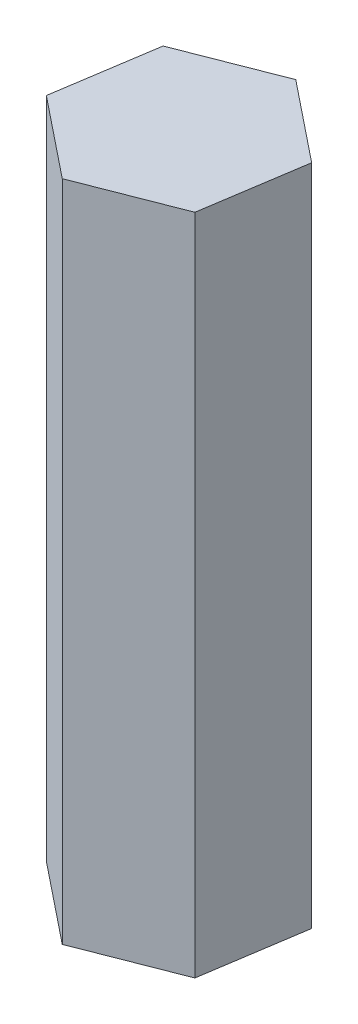
ISO-10303-21;
HEADER;
FILE_DESCRIPTION(('STEP AP214'),'2;1');
FILE_NAME('part.step','',(''),(''),'','','');
FILE_SCHEMA(('AUTOMOTIVE_DESIGN { 1 0 10303 214 1 1 1 1 }'));
ENDSEC;
DATA;
#1=APPLICATION_CONTEXT('core data for automotive mechanical design processes');
#2=APPLICATION_PROTOCOL_DEFINITION('international standard','automotive_design',2000,#1);
#3=PRODUCT_CONTEXT('',#1,'mechanical');
#4=PRODUCT('Part','Part','',(#3));
#5=PRODUCT_RELATED_PRODUCT_CATEGORY('part','',(#4));
#6=PRODUCT_DEFINITION_FORMATION('','',#4);
#7=PRODUCT_DEFINITION_CONTEXT('part definition',#1,'design');
#8=PRODUCT_DEFINITION('design','',#6,#7);
#9=PRODUCT_DEFINITION_SHAPE('','',#8);
#10=(LENGTH_UNIT() NAMED_UNIT(*) SI_UNIT(.MILLI.,.METRE.));
#11=(NAMED_UNIT(*) PLANE_ANGLE_UNIT() SI_UNIT($,.RADIAN.));
#12=(NAMED_UNIT(*) SI_UNIT($,.STERADIAN.) SOLID_ANGLE_UNIT());
#13=UNCERTAINTY_MEASURE_WITH_UNIT(LENGTH_MEASURE(1.E-05),#10,'distance_accuracy_value','');
#14=(GEOMETRIC_REPRESENTATION_CONTEXT(3) GLOBAL_UNCERTAINTY_ASSIGNED_CONTEXT((#13)) GLOBAL_UNIT_ASSIGNED_CONTEXT((#10,
#11,#12)) REPRESENTATION_CONTEXT('',''));
#15=CARTESIAN_POINT('',(0.,0.,0.));
#16=DIRECTION('',(0.,0.,1.));
#17=DIRECTION('',(1.,0.,0.));
#18=AXIS2_PLACEMENT_3D('',#15,#16,#17);
#19=CARTESIAN_POINT('',(14.3918598685271,100.,-5.61201788258893));
#20=DIRECTION('',(-0.625201883015332,0.,0.780463071178953));
#21=DIRECTION('',(0.780463071178953,0.,0.625201883015332));
#22=AXIS2_PLACEMENT_3D('',#19,#20,#21);
#23=PLANE('',#22);
#24=DIRECTION('',(-0.780463071178953,0.,-0.625201883015332));
#25=VECTOR('',#24,1.);
#26=CARTESIAN_POINT('',(14.3918598685271,0.,-5.61201788258893));
#27=LINE('',#26,#25);
#28=CARTESIAN_POINT('',(14.3918598685271,0.,-5.61201788258893));
#29=VERTEX_POINT('',#28);
#30=CARTESIAN_POINT('',(2.33577988144897,0.,-15.2697251951447));
#31=VERTEX_POINT('',#30);
#32=EDGE_CURVE('E134',#29,#31,#27,.T.);
#33=ORIENTED_EDGE('',*,*,#32,.T.);
#34=DIRECTION('',(0.,-1.,0.));
#35=VECTOR('',#34,1.);
#36=CARTESIAN_POINT('',(2.33577988144897,100.,-15.2697251951447));
#37=LINE('',#36,#35);
#38=CARTESIAN_POINT('',(2.33577988144897,100.,-15.2697251951447));
#39=VERTEX_POINT('',#38);
#40=EDGE_CURVE('E11',#39,#31,#37,.T.);
#41=ORIENTED_EDGE('',*,*,#40,.F.);
#42=DIRECTION('',(-0.780463071178953,0.,-0.625201883015332));
#43=VECTOR('',#42,1.);
#44=CARTESIAN_POINT('',(14.3918598685271,100.,-5.61201788258893));
#45=LINE('',#44,#43);
#46=CARTESIAN_POINT('',(14.3918598685271,100.,-5.61201788258893));
#47=VERTEX_POINT('',#46);
#48=EDGE_CURVE('E150',#47,#39,#45,.T.);
#49=ORIENTED_EDGE('',*,*,#48,.F.);
#50=DIRECTION('',(0.,-1.,0.));
#51=VECTOR('',#50,1.);
#52=CARTESIAN_POINT('',(14.3918598685271,100.,-5.61201788258893));
#53=LINE('',#52,#51);
#54=EDGE_CURVE('E130',#47,#29,#53,.T.);
#55=ORIENTED_EDGE('',*,*,#54,.T.);
#56=EDGE_LOOP('',(#33,#41,#49,#55));
#57=FACE_BOUND('',#56,.T.);
#58=ADVANCED_FACE('F45',(#57),#23,.F.);
#59=CARTESIAN_POINT('',(2.33577988144897,100.,-15.2697251951447));
#60=DIRECTION('',(0.363299904848929,0.,0.931672248774621));
#61=DIRECTION('',(0.931672248774621,0.,-0.363299904848929));
#62=AXIS2_PLACEMENT_3D('',#59,#60,#61);
#63=PLANE('',#62);
#64=DIRECTION('',(-0.931672248774621,0.,0.363299904848929));
#65=VECTOR('',#64,1.);
#66=CARTESIAN_POINT('',(2.33577988144897,0.,-15.2697251951447));
#67=LINE('',#66,#65);
#68=CARTESIAN_POINT('',(-12.0560799870781,0.,-9.65770731255575));
#69=VERTEX_POINT('',#68);
#70=EDGE_CURVE('E138',#31,#69,#67,.T.);
#71=ORIENTED_EDGE('',*,*,#70,.T.);
#72=DIRECTION('',(0.,-1.,0.));
#73=VECTOR('',#72,1.);
#74=CARTESIAN_POINT('',(-12.0560799870781,100.,-9.65770731255575));
#75=LINE('',#74,#73);
#76=CARTESIAN_POINT('',(-12.0560799870781,100.,-9.65770731255575));
#77=VERTEX_POINT('',#76);
#78=EDGE_CURVE('E54',#77,#69,#75,.T.);
#79=ORIENTED_EDGE('',*,*,#78,.F.);
#80=DIRECTION('',(-0.931672248774621,0.,0.363299904848929));
#81=VECTOR('',#80,1.);
#82=CARTESIAN_POINT('',(2.33577988144897,100.,-15.2697251951447));
#83=LINE('',#82,#81);
#84=EDGE_CURVE('E99',#39,#77,#83,.T.);
#85=ORIENTED_EDGE('',*,*,#84,.F.);
#86=ORIENTED_EDGE('',*,*,#40,.T.);
#87=EDGE_LOOP('',(#71,#79,#85,#86));
#88=FACE_BOUND('',#87,.T.);
#89=ADVANCED_FACE('F178',(#88),#63,.F.);
#90=CARTESIAN_POINT('',(-12.0560799870781,100.,-9.65770731255575));
#91=DIRECTION('',(0.988501787864262,0.,0.151209177595668));
#92=DIRECTION('',(0.151209177595668,0.,-0.988501787864262));
#93=AXIS2_PLACEMENT_3D('',#90,#91,#92);
#94=PLANE('',#93);
#95=DIRECTION('',(-0.151209177595668,0.,0.988501787864262));
#96=VECTOR('',#95,1.);
#97=CARTESIAN_POINT('',(-12.0560799870781,0.,-9.65770731255575));
#98=LINE('',#97,#96);
#99=CARTESIAN_POINT('',(-14.3918598685271,0.,5.61201788258893));
#100=VERTEX_POINT('',#99);
#101=EDGE_CURVE('E141',#69,#100,#98,.T.);
#102=ORIENTED_EDGE('',*,*,#101,.T.);
#103=DIRECTION('',(0.,-1.,0.));
#104=VECTOR('',#103,1.);
#105=CARTESIAN_POINT('',(-14.3918598685271,100.,5.61201788258893));
#106=LINE('',#105,#104);
#107=CARTESIAN_POINT('',(-14.3918598685271,100.,5.61201788258893));
#108=VERTEX_POINT('',#107);
#109=EDGE_CURVE('E123',#108,#100,#106,.T.);
#110=ORIENTED_EDGE('',*,*,#109,.F.);
#111=DIRECTION('',(-0.151209177595668,0.,0.988501787864262));
#112=VECTOR('',#111,1.);
#113=CARTESIAN_POINT('',(-12.0560799870781,100.,-9.65770731255575));
#114=LINE('',#113,#112);
#115=EDGE_CURVE('E112',#77,#108,#114,.T.);
#116=ORIENTED_EDGE('',*,*,#115,.F.);
#117=ORIENTED_EDGE('',*,*,#78,.T.);
#118=EDGE_LOOP('',(#102,#110,#116,#117));
#119=FACE_BOUND('',#118,.T.);
#120=ADVANCED_FACE('F160',(#119),#94,.F.);
#121=CARTESIAN_POINT('',(-14.3918598685271,100.,5.61201788258893));
#122=DIRECTION('',(0.625201883015332,0.,-0.780463071178953));
#123=DIRECTION('',(-0.780463071178953,0.,-0.625201883015332));
#124=AXIS2_PLACEMENT_3D('',#121,#122,#123);
#125=PLANE('',#124);
#126=DIRECTION('',(0.780463071178953,0.,0.625201883015332));
#127=VECTOR('',#126,1.);
#128=CARTESIAN_POINT('',(-14.3918598685271,0.,5.61201788258893));
#129=LINE('',#128,#127);
#130=CARTESIAN_POINT('',(-2.33577988144896,0.,15.2697251951447));
#131=VERTEX_POINT('',#130);
#132=EDGE_CURVE('E121',#100,#131,#129,.T.);
#133=ORIENTED_EDGE('',*,*,#132,.T.);
#134=DIRECTION('',(0.,-1.,0.));
#135=VECTOR('',#134,1.);
#136=CARTESIAN_POINT('',(-2.33577988144896,100.,15.2697251951447));
#137=LINE('',#136,#135);
#138=CARTESIAN_POINT('',(-2.33577988144896,100.,15.2697251951447));
#139=VERTEX_POINT('',#138);
#140=EDGE_CURVE('E118',#139,#131,#137,.T.);
#141=ORIENTED_EDGE('',*,*,#140,.F.);
#142=DIRECTION('',(0.780463071178953,0.,0.625201883015332));
#143=VECTOR('',#142,1.);
#144=CARTESIAN_POINT('',(-14.3918598685271,100.,5.61201788258893));
#145=LINE('',#144,#143);
#146=EDGE_CURVE('E106',#108,#139,#145,.T.);
#147=ORIENTED_EDGE('',*,*,#146,.F.);
#148=ORIENTED_EDGE('',*,*,#109,.T.);
#149=EDGE_LOOP('',(#133,#141,#147,#148));
#150=FACE_BOUND('',#149,.T.);
#151=ADVANCED_FACE('F119',(#150),#125,.F.);
#152=CARTESIAN_POINT('',(-2.33577988144896,100.,15.2697251951447));
#153=DIRECTION('',(-0.363299904848929,0.,-0.931672248774621));
#154=DIRECTION('',(-0.931672248774621,0.,0.363299904848929));
#155=AXIS2_PLACEMENT_3D('',#152,#153,#154);
#156=PLANE('',#155);
#157=DIRECTION('',(0.931672248774621,0.,-0.36329990484893));
#158=VECTOR('',#157,1.);
#159=CARTESIAN_POINT('',(-2.33577988144896,0.,15.2697251951447));
#160=LINE('',#159,#158);
#161=CARTESIAN_POINT('',(12.0560799870781,0.,9.65770731255575));
#162=VERTEX_POINT('',#161);
#163=EDGE_CURVE('E85',#131,#162,#160,.T.);
#164=ORIENTED_EDGE('',*,*,#163,.T.);
#165=DIRECTION('',(0.,-1.,0.));
#166=VECTOR('',#165,1.);
#167=CARTESIAN_POINT('',(12.0560799870781,100.,9.65770731255575));
#168=LINE('',#167,#166);
#169=CARTESIAN_POINT('',(12.0560799870781,100.,9.65770731255575));
#170=VERTEX_POINT('',#169);
#171=EDGE_CURVE('E124',#170,#162,#168,.T.);
#172=ORIENTED_EDGE('',*,*,#171,.F.);
#173=DIRECTION('',(0.931672248774621,0.,-0.36329990484893));
#174=VECTOR('',#173,1.);
#175=CARTESIAN_POINT('',(-2.33577988144896,100.,15.2697251951447));
#176=LINE('',#175,#174);
#177=EDGE_CURVE('E110',#139,#170,#176,.T.);
#178=ORIENTED_EDGE('',*,*,#177,.F.);
#179=ORIENTED_EDGE('',*,*,#140,.T.);
#180=EDGE_LOOP('',(#164,#172,#178,#179));
#181=FACE_BOUND('',#180,.T.);
#182=ADVANCED_FACE('F126',(#181),#156,.F.);
#183=CARTESIAN_POINT('',(12.0560799870781,100.,9.65770731255575));
#184=DIRECTION('',(-0.988501787864262,0.,-0.151209177595668));
#185=DIRECTION('',(-0.151209177595668,0.,0.988501787864262));
#186=AXIS2_PLACEMENT_3D('',#183,#184,#185);
#187=PLANE('',#186);
#188=DIRECTION('',(0.151209177595668,0.,-0.988501787864261));
#189=VECTOR('',#188,1.);
#190=CARTESIAN_POINT('',(12.0560799870781,0.,9.65770731255575));
#191=LINE('',#190,#189);
#192=EDGE_CURVE('E91',#162,#29,#191,.T.);
#193=ORIENTED_EDGE('',*,*,#192,.T.);
#194=ORIENTED_EDGE('',*,*,#54,.F.);
#195=DIRECTION('',(0.151209177595668,0.,-0.988501787864261));
#196=VECTOR('',#195,1.);
#197=CARTESIAN_POINT('',(12.0560799870781,100.,9.65770731255575));
#198=LINE('',#197,#196);
#199=EDGE_CURVE('E62',#170,#47,#198,.T.);
#200=ORIENTED_EDGE('',*,*,#199,.F.);
#201=ORIENTED_EDGE('',*,*,#171,.T.);
#202=EDGE_LOOP('',(#193,#194,#200,#201));
#203=FACE_BOUND('',#202,.T.);
#204=ADVANCED_FACE('F167',(#203),#187,.F.);
#205=CARTESIAN_POINT('',(0.,100.,0.));
#206=DIRECTION('',(0.,1.,0.));
#207=DIRECTION('',(0.,0.,1.));
#208=AXIS2_PLACEMENT_3D('',#205,#206,#207);
#209=PLANE('',#208);
#210=ORIENTED_EDGE('',*,*,#48,.T.);
#211=ORIENTED_EDGE('',*,*,#84,.T.);
#212=ORIENTED_EDGE('',*,*,#115,.T.);
#213=ORIENTED_EDGE('',*,*,#146,.T.);
#214=ORIENTED_EDGE('',*,*,#177,.T.);
#215=ORIENTED_EDGE('',*,*,#199,.T.);
#216=EDGE_LOOP('',(#210,#211,#212,#213,#214,#215));
#217=FACE_BOUND('',#216,.T.);
#218=ADVANCED_FACE('F108',(#217),#209,.T.);
#219=CARTESIAN_POINT('',(0.,0.,0.));
#220=DIRECTION('',(0.,1.,0.));
#221=DIRECTION('',(0.,0.,1.));
#222=AXIS2_PLACEMENT_3D('',#219,#220,#221);
#223=PLANE('',#222);
#224=ORIENTED_EDGE('',*,*,#32,.F.);
#225=ORIENTED_EDGE('',*,*,#192,.F.);
#226=ORIENTED_EDGE('',*,*,#163,.F.);
#227=ORIENTED_EDGE('',*,*,#132,.F.);
#228=ORIENTED_EDGE('',*,*,#101,.F.);
#229=ORIENTED_EDGE('',*,*,#70,.F.);
#230=EDGE_LOOP('',(#224,#225,#226,#227,#228,#229));
#231=FACE_BOUND('',#230,.T.);
#232=ADVANCED_FACE('F163',(#231),#223,.F.);
#233=CLOSED_SHELL('',(#58,#89,#120,#151,#182,#204,#218,#232));
#234=MANIFOLD_SOLID_BREP('B2',#233);
#235=ADVANCED_BREP_SHAPE_REPRESENTATION('',(#18,#234),#14);
#236=SHAPE_DEFINITION_REPRESENTATION(#9,#235);
ENDSEC;
END-ISO-10303-21;
